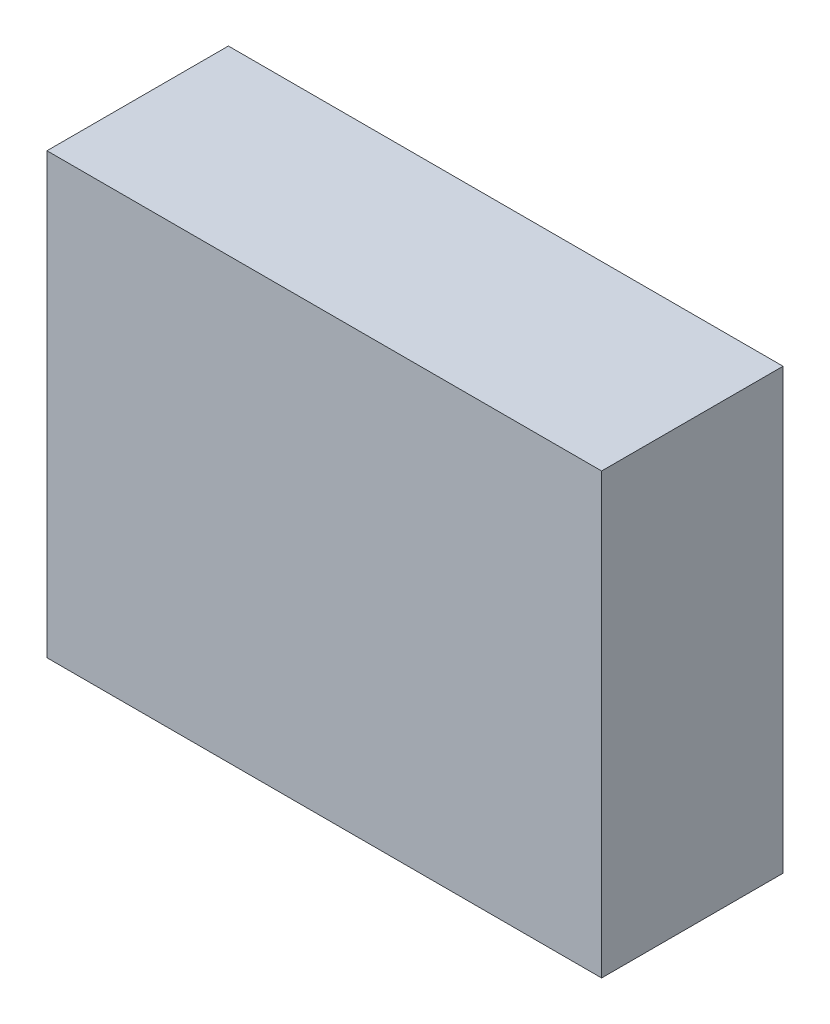
ISO-10303-21;
HEADER;
FILE_DESCRIPTION(('STEP AP214'),'2;1');
FILE_NAME('part.step','',(''),(''),'','','');
FILE_SCHEMA(('AUTOMOTIVE_DESIGN { 1 0 10303 214 1 1 1 1 }'));
ENDSEC;
DATA;
#1=APPLICATION_CONTEXT('core data for automotive mechanical design processes');
#2=APPLICATION_PROTOCOL_DEFINITION('international standard','automotive_design',2000,#1);
#3=PRODUCT_CONTEXT('',#1,'mechanical');
#4=PRODUCT('Part','Part','',(#3));
#5=PRODUCT_RELATED_PRODUCT_CATEGORY('part','',(#4));
#6=PRODUCT_DEFINITION_FORMATION('','',#4);
#7=PRODUCT_DEFINITION_CONTEXT('part definition',#1,'design');
#8=PRODUCT_DEFINITION('design','',#6,#7);
#9=PRODUCT_DEFINITION_SHAPE('','',#8);
#10=(LENGTH_UNIT() NAMED_UNIT(*) SI_UNIT(.MILLI.,.METRE.));
#11=(NAMED_UNIT(*) PLANE_ANGLE_UNIT() SI_UNIT($,.RADIAN.));
#12=(NAMED_UNIT(*) SI_UNIT($,.STERADIAN.) SOLID_ANGLE_UNIT());
#13=UNCERTAINTY_MEASURE_WITH_UNIT(LENGTH_MEASURE(1.E-05),#10,'distance_accuracy_value','');
#14=(GEOMETRIC_REPRESENTATION_CONTEXT(3) GLOBAL_UNCERTAINTY_ASSIGNED_CONTEXT((#13)) GLOBAL_UNIT_ASSIGNED_CONTEXT((#10,
#11,#12)) REPRESENTATION_CONTEXT('',''));
#15=CARTESIAN_POINT('',(0.,0.,0.));
#16=DIRECTION('',(0.,0.,1.));
#17=DIRECTION('',(1.,0.,0.));
#18=AXIS2_PLACEMENT_3D('',#15,#16,#17);
#19=CARTESIAN_POINT('',(-2.40000028,1.90000128,-1.5699994));
#20=DIRECTION('',(0.,0.,-1.));
#21=DIRECTION('',(1.,0.,0.));
#22=AXIS2_PLACEMENT_3D('',#19,#20,#21);
#23=PLANE('',#22);
#24=DIRECTION('',(0.,1.,0.));
#25=VECTOR('',#24,1.);
#26=CARTESIAN_POINT('',(2.40000028,1.90000128,-1.5699994));
#27=LINE('',#26,#25);
#28=CARTESIAN_POINT('',(2.40000028,1.90000128,-1.5699994));
#29=VERTEX_POINT('',#28);
#30=CARTESIAN_POINT('',(2.40000028,-1.89999874,-1.5699994));
#31=VERTEX_POINT('',#30);
#32=EDGE_CURVE('E88',#29,#31,#27,.F.);
#33=ORIENTED_EDGE('',*,*,#32,.T.);
#34=DIRECTION('',(1.,0.,0.));
#35=VECTOR('',#34,1.);
#36=CARTESIAN_POINT('',(2.40000028,-1.89999874,-1.5699994));
#37=LINE('',#36,#35);
#38=CARTESIAN_POINT('',(-2.40000028,-1.89999874,-1.5699994));
#39=VERTEX_POINT('',#38);
#40=EDGE_CURVE('E81',#31,#39,#37,.F.);
#41=ORIENTED_EDGE('',*,*,#40,.T.);
#42=DIRECTION('',(0.,1.,0.));
#43=VECTOR('',#42,1.);
#44=CARTESIAN_POINT('',(-2.40000028,-1.89999874,-1.5699994));
#45=LINE('',#44,#43);
#46=CARTESIAN_POINT('',(-2.40000028,1.90000128,-1.5699994));
#47=VERTEX_POINT('',#46);
#48=EDGE_CURVE('E40',#39,#47,#45,.T.);
#49=ORIENTED_EDGE('',*,*,#48,.T.);
#50=DIRECTION('',(1.,0.,0.));
#51=VECTOR('',#50,1.);
#52=CARTESIAN_POINT('',(-2.40000028,1.90000128,-1.5699994));
#53=LINE('',#52,#51);
#54=EDGE_CURVE('E100',#47,#29,#53,.T.);
#55=ORIENTED_EDGE('',*,*,#54,.T.);
#56=EDGE_LOOP('',(#33,#41,#49,#55));
#57=FACE_BOUND('',#56,.T.);
#58=ADVANCED_FACE('F37',(#57),#23,.T.);
#59=CARTESIAN_POINT('',(-2.40000028,-1.89999874,0.));
#60=DIRECTION('',(-1.,0.,0.));
#61=DIRECTION('',(0.,0.,-1.));
#62=AXIS2_PLACEMENT_3D('',#59,#60,#61);
#63=PLANE('',#62);
#64=DIRECTION('',(0.,0.,-1.));
#65=VECTOR('',#64,1.);
#66=CARTESIAN_POINT('',(-2.40000028,1.90000128,0.));
#67=LINE('',#66,#65);
#68=CARTESIAN_POINT('',(-2.40000028,1.90000128,0.));
#69=VERTEX_POINT('',#68);
#70=EDGE_CURVE('E92',#69,#47,#67,.T.);
#71=ORIENTED_EDGE('',*,*,#70,.T.);
#72=ORIENTED_EDGE('',*,*,#48,.F.);
#73=DIRECTION('',(0.,0.,1.));
#74=VECTOR('',#73,1.);
#75=CARTESIAN_POINT('',(-2.40000028,-1.89999874,0.));
#76=LINE('',#75,#74);
#77=CARTESIAN_POINT('',(-2.40000028,-1.89999874,0.));
#78=VERTEX_POINT('',#77);
#79=EDGE_CURVE('E77',#39,#78,#76,.T.);
#80=ORIENTED_EDGE('',*,*,#79,.T.);
#81=DIRECTION('',(0.,1.,0.));
#82=VECTOR('',#81,1.);
#83=CARTESIAN_POINT('',(-2.40000028,1.90000128,0.));
#84=LINE('',#83,#82);
#85=EDGE_CURVE('E105',#69,#78,#84,.F.);
#86=ORIENTED_EDGE('',*,*,#85,.F.);
#87=EDGE_LOOP('',(#71,#72,#80,#86));
#88=FACE_BOUND('',#87,.T.);
#89=ADVANCED_FACE('F91',(#88),#63,.T.);
#90=CARTESIAN_POINT('',(2.40000028,-1.89999874,0.));
#91=DIRECTION('',(0.,-1.,0.));
#92=DIRECTION('',(0.,0.,1.));
#93=AXIS2_PLACEMENT_3D('',#90,#91,#92);
#94=PLANE('',#93);
#95=ORIENTED_EDGE('',*,*,#79,.F.);
#96=ORIENTED_EDGE('',*,*,#40,.F.);
#97=DIRECTION('',(0.,0.,1.));
#98=VECTOR('',#97,1.);
#99=CARTESIAN_POINT('',(2.40000028,-1.89999874,0.));
#100=LINE('',#99,#98);
#101=CARTESIAN_POINT('',(2.40000028,-1.89999874,0.));
#102=VERTEX_POINT('',#101);
#103=EDGE_CURVE('E72',#31,#102,#100,.T.);
#104=ORIENTED_EDGE('',*,*,#103,.T.);
#105=DIRECTION('',(1.,0.,0.));
#106=VECTOR('',#105,1.);
#107=CARTESIAN_POINT('',(-2.40000028,-1.89999874,0.));
#108=LINE('',#107,#106);
#109=EDGE_CURVE('E84',#78,#102,#108,.T.);
#110=ORIENTED_EDGE('',*,*,#109,.F.);
#111=EDGE_LOOP('',(#95,#96,#104,#110));
#112=FACE_BOUND('',#111,.T.);
#113=ADVANCED_FACE('F79',(#112),#94,.T.);
#114=CARTESIAN_POINT('',(2.40000028,1.90000128,0.));
#115=DIRECTION('',(1.,0.,0.));
#116=DIRECTION('',(0.,0.,1.));
#117=AXIS2_PLACEMENT_3D('',#114,#115,#116);
#118=PLANE('',#117);
#119=ORIENTED_EDGE('',*,*,#103,.F.);
#120=ORIENTED_EDGE('',*,*,#32,.F.);
#121=DIRECTION('',(0.,0.,-1.));
#122=VECTOR('',#121,1.);
#123=CARTESIAN_POINT('',(2.40000028,1.90000128,0.));
#124=LINE('',#123,#122);
#125=CARTESIAN_POINT('',(2.40000028,1.90000128,0.));
#126=VERTEX_POINT('',#125);
#127=EDGE_CURVE('E102',#29,#126,#124,.F.);
#128=ORIENTED_EDGE('',*,*,#127,.T.);
#129=DIRECTION('',(0.,1.,0.));
#130=VECTOR('',#129,1.);
#131=CARTESIAN_POINT('',(2.40000028,1.90000128,0.));
#132=LINE('',#131,#130);
#133=EDGE_CURVE('E46',#102,#126,#132,.T.);
#134=ORIENTED_EDGE('',*,*,#133,.F.);
#135=EDGE_LOOP('',(#119,#120,#128,#134));
#136=FACE_BOUND('',#135,.T.);
#137=ADVANCED_FACE('F110',(#136),#118,.T.);
#138=CARTESIAN_POINT('',(-2.40000028,1.90000128,0.));
#139=DIRECTION('',(0.,1.,0.));
#140=DIRECTION('',(0.,0.,-1.));
#141=AXIS2_PLACEMENT_3D('',#138,#139,#140);
#142=PLANE('',#141);
#143=ORIENTED_EDGE('',*,*,#127,.F.);
#144=ORIENTED_EDGE('',*,*,#54,.F.);
#145=ORIENTED_EDGE('',*,*,#70,.F.);
#146=DIRECTION('',(1.,0.,0.));
#147=VECTOR('',#146,1.);
#148=CARTESIAN_POINT('',(-2.40000028,1.90000128,0.));
#149=LINE('',#148,#147);
#150=EDGE_CURVE('E11',#126,#69,#149,.F.);
#151=ORIENTED_EDGE('',*,*,#150,.F.);
#152=EDGE_LOOP('',(#143,#144,#145,#151));
#153=FACE_BOUND('',#152,.T.);
#154=ADVANCED_FACE('F111',(#153),#142,.T.);
#155=CARTESIAN_POINT('',(-2.40000028,1.90000128,0.));
#156=DIRECTION('',(0.,0.,-1.));
#157=DIRECTION('',(1.,0.,0.));
#158=AXIS2_PLACEMENT_3D('',#155,#156,#157);
#159=PLANE('',#158);
#160=ORIENTED_EDGE('',*,*,#133,.T.);
#161=ORIENTED_EDGE('',*,*,#150,.T.);
#162=ORIENTED_EDGE('',*,*,#85,.T.);
#163=ORIENTED_EDGE('',*,*,#109,.T.);
#164=EDGE_LOOP('',(#160,#161,#162,#163));
#165=FACE_BOUND('',#164,.T.);
#166=ADVANCED_FACE('F109',(#165),#159,.F.);
#167=CLOSED_SHELL('',(#58,#89,#113,#137,#154,#166));
#168=MANIFOLD_SOLID_BREP('B2',#167);
#169=ADVANCED_BREP_SHAPE_REPRESENTATION('',(#18,#168),#14);
#170=SHAPE_DEFINITION_REPRESENTATION(#9,#169);
ENDSEC;
END-ISO-10303-21;
